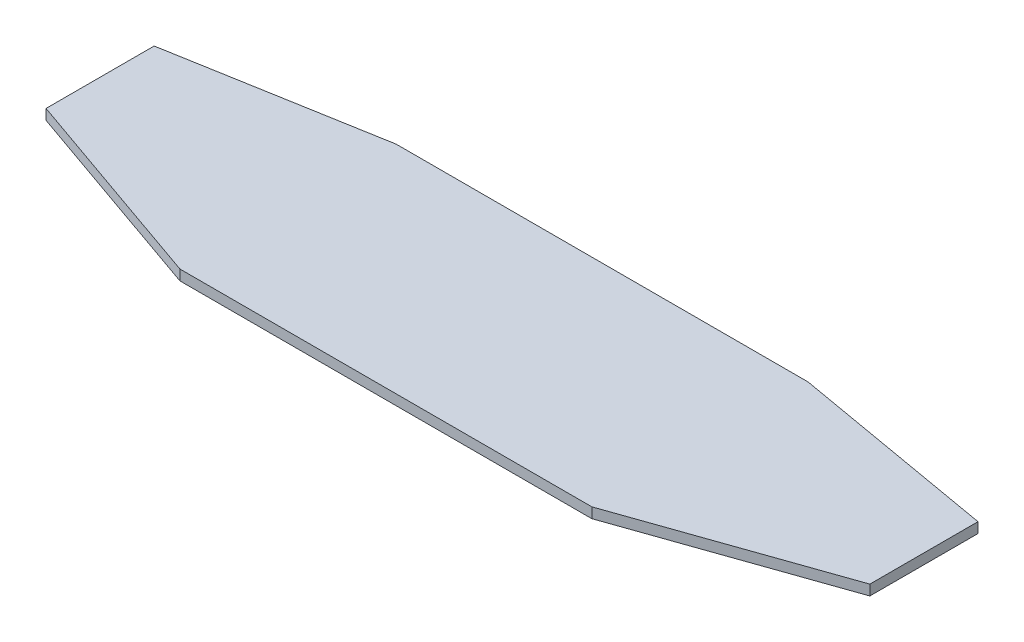
ISO-10303-21;
HEADER;
FILE_DESCRIPTION(('STEP AP214'),'2;1');
FILE_NAME('part.step','',(''),(''),'','','');
FILE_SCHEMA(('AUTOMOTIVE_DESIGN { 1 0 10303 214 1 1 1 1 }'));
ENDSEC;
DATA;
#1=APPLICATION_CONTEXT('core data for automotive mechanical design processes');
#2=APPLICATION_PROTOCOL_DEFINITION('international standard','automotive_design',2000,#1);
#3=PRODUCT_CONTEXT('',#1,'mechanical');
#4=PRODUCT('Part','Part','',(#3));
#5=PRODUCT_RELATED_PRODUCT_CATEGORY('part','',(#4));
#6=PRODUCT_DEFINITION_FORMATION('','',#4);
#7=PRODUCT_DEFINITION_CONTEXT('part definition',#1,'design');
#8=PRODUCT_DEFINITION('design','',#6,#7);
#9=PRODUCT_DEFINITION_SHAPE('','',#8);
#10=(LENGTH_UNIT() NAMED_UNIT(*) SI_UNIT(.MILLI.,.METRE.));
#11=(NAMED_UNIT(*) PLANE_ANGLE_UNIT() SI_UNIT($,.RADIAN.));
#12=(NAMED_UNIT(*) SI_UNIT($,.STERADIAN.) SOLID_ANGLE_UNIT());
#13=UNCERTAINTY_MEASURE_WITH_UNIT(LENGTH_MEASURE(1.E-05),#10,'distance_accuracy_value','');
#14=(GEOMETRIC_REPRESENTATION_CONTEXT(3) GLOBAL_UNCERTAINTY_ASSIGNED_CONTEXT((#13)) GLOBAL_UNIT_ASSIGNED_CONTEXT((#10,
#11,#12)) REPRESENTATION_CONTEXT('',''));
#15=CARTESIAN_POINT('',(0.,0.,0.));
#16=DIRECTION('',(0.,0.,1.));
#17=DIRECTION('',(1.,0.,0.));
#18=AXIS2_PLACEMENT_3D('',#15,#16,#17);
#19=CARTESIAN_POINT('',(-400.,10.,-105.));
#20=DIRECTION('',(0.172380331752248,0.,0.985030467155704));
#21=DIRECTION('',(0.985030467155704,0.,-0.172380331752248));
#22=AXIS2_PLACEMENT_3D('',#19,#20,#21);
#23=PLANE('',#22);
#24=DIRECTION('',(-0.985030467155704,0.,0.172380331752248));
#25=VECTOR('',#24,1.);
#26=CARTESIAN_POINT('',(-400.,0.,-105.));
#27=LINE('',#26,#25);
#28=CARTESIAN_POINT('',(-200.,0.,-140.));
#29=VERTEX_POINT('',#28);
#30=CARTESIAN_POINT('',(-400.,0.,-105.));
#31=VERTEX_POINT('',#30);
#32=EDGE_CURVE('E97',#29,#31,#27,.T.);
#33=ORIENTED_EDGE('',*,*,#32,.T.);
#34=DIRECTION('',(0.,-1.,0.));
#35=VECTOR('',#34,1.);
#36=CARTESIAN_POINT('',(-400.,10.,-105.));
#37=LINE('',#36,#35);
#38=CARTESIAN_POINT('',(-400.,10.,-105.));
#39=VERTEX_POINT('',#38);
#40=EDGE_CURVE('E11',#39,#31,#37,.T.);
#41=ORIENTED_EDGE('',*,*,#40,.F.);
#42=DIRECTION('',(-0.985030467155704,0.,0.172380331752248));
#43=VECTOR('',#42,1.);
#44=CARTESIAN_POINT('',(-400.,10.,-105.));
#45=LINE('',#44,#43);
#46=CARTESIAN_POINT('',(-200.,10.,-140.));
#47=VERTEX_POINT('',#46);
#48=EDGE_CURVE('E124',#47,#39,#45,.T.);
#49=ORIENTED_EDGE('',*,*,#48,.F.);
#50=DIRECTION('',(0.,-1.,0.));
#51=VECTOR('',#50,1.);
#52=CARTESIAN_POINT('',(-200.,10.,-140.));
#53=LINE('',#52,#51);
#54=EDGE_CURVE('E110',#47,#29,#53,.T.);
#55=ORIENTED_EDGE('',*,*,#54,.T.);
#56=EDGE_LOOP('',(#33,#41,#49,#55));
#57=FACE_BOUND('',#56,.T.);
#58=ADVANCED_FACE('F29',(#57),#23,.F.);
#59=CARTESIAN_POINT('',(-400.,10.,0.));
#60=DIRECTION('',(1.,0.,0.));
#61=DIRECTION('',(0.,0.,-1.));
#62=AXIS2_PLACEMENT_3D('',#59,#60,#61);
#63=PLANE('',#62);
#64=DIRECTION('',(0.,0.,1.));
#65=VECTOR('',#64,1.);
#66=CARTESIAN_POINT('',(-400.,0.,0.));
#67=LINE('',#66,#65);
#68=CARTESIAN_POINT('',(-400.,0.,0.));
#69=VERTEX_POINT('',#68);
#70=EDGE_CURVE('E93',#31,#69,#67,.T.);
#71=ORIENTED_EDGE('',*,*,#70,.T.);
#72=DIRECTION('',(0.,-1.,0.));
#73=VECTOR('',#72,1.);
#74=CARTESIAN_POINT('',(-400.,10.,0.));
#75=LINE('',#74,#73);
#76=CARTESIAN_POINT('',(-400.,10.,0.));
#77=VERTEX_POINT('',#76);
#78=EDGE_CURVE('E36',#77,#69,#75,.T.);
#79=ORIENTED_EDGE('',*,*,#78,.F.);
#80=DIRECTION('',(0.,0.,1.));
#81=VECTOR('',#80,1.);
#82=CARTESIAN_POINT('',(-400.,10.,0.));
#83=LINE('',#82,#81);
#84=EDGE_CURVE('E106',#39,#77,#83,.T.);
#85=ORIENTED_EDGE('',*,*,#84,.F.);
#86=ORIENTED_EDGE('',*,*,#40,.T.);
#87=EDGE_LOOP('',(#71,#79,#85,#86));
#88=FACE_BOUND('',#87,.T.);
#89=ADVANCED_FACE('F105',(#88),#63,.F.);
#90=CARTESIAN_POINT('',(-200.,10.,70.));
#91=DIRECTION('',(0.330350424728106,0.,-0.943858356366017));
#92=DIRECTION('',(-0.943858356366017,0.,-0.330350424728106));
#93=AXIS2_PLACEMENT_3D('',#90,#91,#92);
#94=PLANE('',#93);
#95=DIRECTION('',(0.943858356366017,0.,0.330350424728106));
#96=VECTOR('',#95,1.);
#97=CARTESIAN_POINT('',(-200.,0.,70.));
#98=LINE('',#97,#96);
#99=CARTESIAN_POINT('',(-200.,0.,70.));
#100=VERTEX_POINT('',#99);
#101=EDGE_CURVE('E99',#69,#100,#98,.T.);
#102=ORIENTED_EDGE('',*,*,#101,.T.);
#103=DIRECTION('',(0.,-1.,0.));
#104=VECTOR('',#103,1.);
#105=CARTESIAN_POINT('',(-200.,10.,70.));
#106=LINE('',#105,#104);
#107=CARTESIAN_POINT('',(-200.,10.,70.));
#108=VERTEX_POINT('',#107);
#109=EDGE_CURVE('E150',#108,#100,#106,.T.);
#110=ORIENTED_EDGE('',*,*,#109,.F.);
#111=DIRECTION('',(0.943858356366017,0.,0.330350424728106));
#112=VECTOR('',#111,1.);
#113=CARTESIAN_POINT('',(-200.,10.,70.));
#114=LINE('',#113,#112);
#115=EDGE_CURVE('E127',#77,#108,#114,.T.);
#116=ORIENTED_EDGE('',*,*,#115,.F.);
#117=ORIENTED_EDGE('',*,*,#78,.T.);
#118=EDGE_LOOP('',(#102,#110,#116,#117));
#119=FACE_BOUND('',#118,.T.);
#120=ADVANCED_FACE('F154',(#119),#94,.F.);
#121=CARTESIAN_POINT('',(200.,10.,70.));
#122=DIRECTION('',(0.,0.,-1.));
#123=DIRECTION('',(-1.,0.,0.));
#124=AXIS2_PLACEMENT_3D('',#121,#122,#123);
#125=PLANE('',#124);
#126=DIRECTION('',(1.,0.,0.));
#127=VECTOR('',#126,1.);
#128=CARTESIAN_POINT('',(200.,0.,70.));
#129=LINE('',#128,#127);
#130=CARTESIAN_POINT('',(200.,0.,70.));
#131=VERTEX_POINT('',#130);
#132=EDGE_CURVE('E114',#100,#131,#129,.T.);
#133=ORIENTED_EDGE('',*,*,#132,.T.);
#134=DIRECTION('',(0.,-1.,0.));
#135=VECTOR('',#134,1.);
#136=CARTESIAN_POINT('',(200.,10.,70.));
#137=LINE('',#136,#135);
#138=CARTESIAN_POINT('',(200.,10.,70.));
#139=VERTEX_POINT('',#138);
#140=EDGE_CURVE('E147',#139,#131,#137,.T.);
#141=ORIENTED_EDGE('',*,*,#140,.F.);
#142=DIRECTION('',(1.,0.,0.));
#143=VECTOR('',#142,1.);
#144=CARTESIAN_POINT('',(200.,10.,70.));
#145=LINE('',#144,#143);
#146=EDGE_CURVE('E129',#108,#139,#145,.T.);
#147=ORIENTED_EDGE('',*,*,#146,.F.);
#148=ORIENTED_EDGE('',*,*,#109,.T.);
#149=EDGE_LOOP('',(#133,#141,#147,#148));
#150=FACE_BOUND('',#149,.T.);
#151=ADVANCED_FACE('F162',(#150),#125,.F.);
#152=CARTESIAN_POINT('',(400.,10.,0.));
#153=DIRECTION('',(-0.330350424728106,0.,-0.943858356366017));
#154=DIRECTION('',(-0.943858356366017,0.,0.330350424728106));
#155=AXIS2_PLACEMENT_3D('',#152,#153,#154);
#156=PLANE('',#155);
#157=DIRECTION('',(0.943858356366017,0.,-0.330350424728106));
#158=VECTOR('',#157,1.);
#159=CARTESIAN_POINT('',(400.,0.,0.));
#160=LINE('',#159,#158);
#161=CARTESIAN_POINT('',(400.,0.,0.));
#162=VERTEX_POINT('',#161);
#163=EDGE_CURVE('E116',#131,#162,#160,.T.);
#164=ORIENTED_EDGE('',*,*,#163,.T.);
#165=DIRECTION('',(0.,-1.,0.));
#166=VECTOR('',#165,1.);
#167=CARTESIAN_POINT('',(400.,10.,0.));
#168=LINE('',#167,#166);
#169=CARTESIAN_POINT('',(400.,10.,0.));
#170=VERTEX_POINT('',#169);
#171=EDGE_CURVE('E144',#170,#162,#168,.T.);
#172=ORIENTED_EDGE('',*,*,#171,.F.);
#173=DIRECTION('',(0.943858356366017,0.,-0.330350424728106));
#174=VECTOR('',#173,1.);
#175=CARTESIAN_POINT('',(400.,10.,0.));
#176=LINE('',#175,#174);
#177=EDGE_CURVE('E131',#139,#170,#176,.T.);
#178=ORIENTED_EDGE('',*,*,#177,.F.);
#179=ORIENTED_EDGE('',*,*,#140,.T.);
#180=EDGE_LOOP('',(#164,#172,#178,#179));
#181=FACE_BOUND('',#180,.T.);
#182=ADVANCED_FACE('F165',(#181),#156,.F.);
#183=CARTESIAN_POINT('',(400.,10.,-105.));
#184=DIRECTION('',(-1.,0.,0.));
#185=DIRECTION('',(0.,0.,1.));
#186=AXIS2_PLACEMENT_3D('',#183,#184,#185);
#187=PLANE('',#186);
#188=DIRECTION('',(0.,0.,-1.));
#189=VECTOR('',#188,1.);
#190=CARTESIAN_POINT('',(400.,0.,-105.));
#191=LINE('',#190,#189);
#192=CARTESIAN_POINT('',(400.,0.,-105.));
#193=VERTEX_POINT('',#192);
#194=EDGE_CURVE('E118',#162,#193,#191,.T.);
#195=ORIENTED_EDGE('',*,*,#194,.T.);
#196=DIRECTION('',(0.,-1.,0.));
#197=VECTOR('',#196,1.);
#198=CARTESIAN_POINT('',(400.,10.,-105.));
#199=LINE('',#198,#197);
#200=CARTESIAN_POINT('',(400.,10.,-105.));
#201=VERTEX_POINT('',#200);
#202=EDGE_CURVE('E141',#201,#193,#199,.T.);
#203=ORIENTED_EDGE('',*,*,#202,.F.);
#204=DIRECTION('',(0.,0.,-1.));
#205=VECTOR('',#204,1.);
#206=CARTESIAN_POINT('',(400.,10.,-105.));
#207=LINE('',#206,#205);
#208=EDGE_CURVE('E133',#170,#201,#207,.T.);
#209=ORIENTED_EDGE('',*,*,#208,.F.);
#210=ORIENTED_EDGE('',*,*,#171,.T.);
#211=EDGE_LOOP('',(#195,#203,#209,#210));
#212=FACE_BOUND('',#211,.T.);
#213=ADVANCED_FACE('F170',(#212),#187,.F.);
#214=CARTESIAN_POINT('',(200.,10.,-140.));
#215=DIRECTION('',(-0.172380331752248,0.,0.985030467155704));
#216=DIRECTION('',(0.985030467155704,0.,0.172380331752248));
#217=AXIS2_PLACEMENT_3D('',#214,#215,#216);
#218=PLANE('',#217);
#219=DIRECTION('',(-0.985030467155704,0.,-0.172380331752248));
#220=VECTOR('',#219,1.);
#221=CARTESIAN_POINT('',(200.,0.,-140.));
#222=LINE('',#221,#220);
#223=CARTESIAN_POINT('',(200.,0.,-140.));
#224=VERTEX_POINT('',#223);
#225=EDGE_CURVE('E120',#193,#224,#222,.T.);
#226=ORIENTED_EDGE('',*,*,#225,.T.);
#227=DIRECTION('',(0.,-1.,0.));
#228=VECTOR('',#227,1.);
#229=CARTESIAN_POINT('',(200.,10.,-140.));
#230=LINE('',#229,#228);
#231=CARTESIAN_POINT('',(200.,10.,-140.));
#232=VERTEX_POINT('',#231);
#233=EDGE_CURVE('E138',#232,#224,#230,.T.);
#234=ORIENTED_EDGE('',*,*,#233,.F.);
#235=DIRECTION('',(-0.985030467155704,0.,-0.172380331752248));
#236=VECTOR('',#235,1.);
#237=CARTESIAN_POINT('',(200.,10.,-140.));
#238=LINE('',#237,#236);
#239=EDGE_CURVE('E48',#201,#232,#238,.T.);
#240=ORIENTED_EDGE('',*,*,#239,.F.);
#241=ORIENTED_EDGE('',*,*,#202,.T.);
#242=EDGE_LOOP('',(#226,#234,#240,#241));
#243=FACE_BOUND('',#242,.T.);
#244=ADVANCED_FACE('F173',(#243),#218,.F.);
#245=CARTESIAN_POINT('',(-200.,10.,-140.));
#246=DIRECTION('',(0.,0.,1.));
#247=DIRECTION('',(1.,0.,0.));
#248=AXIS2_PLACEMENT_3D('',#245,#246,#247);
#249=PLANE('',#248);
#250=DIRECTION('',(-1.,0.,0.));
#251=VECTOR('',#250,1.);
#252=CARTESIAN_POINT('',(-200.,0.,-140.));
#253=LINE('',#252,#251);
#254=EDGE_CURVE('E122',#224,#29,#253,.T.);
#255=ORIENTED_EDGE('',*,*,#254,.T.);
#256=ORIENTED_EDGE('',*,*,#54,.F.);
#257=DIRECTION('',(-1.,0.,0.));
#258=VECTOR('',#257,1.);
#259=CARTESIAN_POINT('',(-200.,10.,-140.));
#260=LINE('',#259,#258);
#261=EDGE_CURVE('E43',#232,#47,#260,.T.);
#262=ORIENTED_EDGE('',*,*,#261,.F.);
#263=ORIENTED_EDGE('',*,*,#233,.T.);
#264=EDGE_LOOP('',(#255,#256,#262,#263));
#265=FACE_BOUND('',#264,.T.);
#266=ADVANCED_FACE('F175',(#265),#249,.F.);
#267=CARTESIAN_POINT('',(400.,10.,-245.));
#268=DIRECTION('',(0.,-1.,0.));
#269=DIRECTION('',(0.,0.,-1.));
#270=AXIS2_PLACEMENT_3D('',#267,#268,#269);
#271=PLANE('',#270);
#272=ORIENTED_EDGE('',*,*,#48,.T.);
#273=ORIENTED_EDGE('',*,*,#84,.T.);
#274=ORIENTED_EDGE('',*,*,#115,.T.);
#275=ORIENTED_EDGE('',*,*,#146,.T.);
#276=ORIENTED_EDGE('',*,*,#177,.T.);
#277=ORIENTED_EDGE('',*,*,#208,.T.);
#278=ORIENTED_EDGE('',*,*,#239,.T.);
#279=ORIENTED_EDGE('',*,*,#261,.T.);
#280=EDGE_LOOP('',(#272,#273,#274,#275,#276,#277,#278,#279));
#281=FACE_BOUND('',#280,.T.);
#282=ADVANCED_FACE('F157',(#281),#271,.F.);
#283=CARTESIAN_POINT('',(400.,0.,-245.));
#284=DIRECTION('',(0.,-1.,0.));
#285=DIRECTION('',(0.,0.,-1.));
#286=AXIS2_PLACEMENT_3D('',#283,#284,#285);
#287=PLANE('',#286);
#288=ORIENTED_EDGE('',*,*,#32,.F.);
#289=ORIENTED_EDGE('',*,*,#254,.F.);
#290=ORIENTED_EDGE('',*,*,#225,.F.);
#291=ORIENTED_EDGE('',*,*,#194,.F.);
#292=ORIENTED_EDGE('',*,*,#163,.F.);
#293=ORIENTED_EDGE('',*,*,#132,.F.);
#294=ORIENTED_EDGE('',*,*,#101,.F.);
#295=ORIENTED_EDGE('',*,*,#70,.F.);
#296=EDGE_LOOP('',(#288,#289,#290,#291,#292,#293,#294,#295));
#297=FACE_BOUND('',#296,.T.);
#298=ADVANCED_FACE('F94',(#297),#287,.T.);
#299=CLOSED_SHELL('',(#58,#89,#120,#151,#182,#213,#244,#266,#282,#298));
#300=MANIFOLD_SOLID_BREP('B2',#299);
#301=ADVANCED_BREP_SHAPE_REPRESENTATION('',(#18,#300),#14);
#302=SHAPE_DEFINITION_REPRESENTATION(#9,#301);
ENDSEC;
END-ISO-10303-21;
